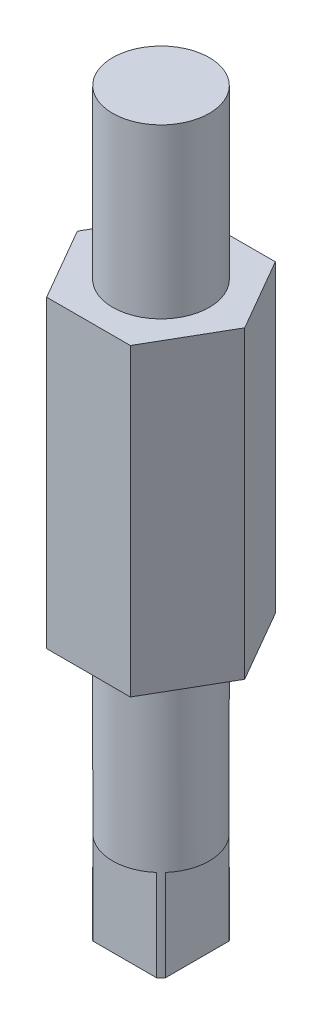
ISO-10303-21;
HEADER;
FILE_DESCRIPTION(('STEP AP214'),'2;1');
FILE_NAME('part.step','',(''),(''),'','','');
FILE_SCHEMA(('AUTOMOTIVE_DESIGN { 1 0 10303 214 1 1 1 1 }'));
ENDSEC;
DATA;
#1=APPLICATION_CONTEXT('core data for automotive mechanical design processes');
#2=APPLICATION_PROTOCOL_DEFINITION('international standard','automotive_design',2000,#1);
#3=PRODUCT_CONTEXT('',#1,'mechanical');
#4=PRODUCT('Part','Part','',(#3));
#5=PRODUCT_RELATED_PRODUCT_CATEGORY('part','',(#4));
#6=PRODUCT_DEFINITION_FORMATION('','',#4);
#7=PRODUCT_DEFINITION_CONTEXT('part definition',#1,'design');
#8=PRODUCT_DEFINITION('design','',#6,#7);
#9=PRODUCT_DEFINITION_SHAPE('','',#8);
#10=(LENGTH_UNIT() NAMED_UNIT(*) SI_UNIT(.MILLI.,.METRE.));
#11=(NAMED_UNIT(*) PLANE_ANGLE_UNIT() SI_UNIT($,.RADIAN.));
#12=(NAMED_UNIT(*) SI_UNIT($,.STERADIAN.) SOLID_ANGLE_UNIT());
#13=UNCERTAINTY_MEASURE_WITH_UNIT(LENGTH_MEASURE(1.E-05),#10,'distance_accuracy_value','');
#14=(GEOMETRIC_REPRESENTATION_CONTEXT(3) GLOBAL_UNCERTAINTY_ASSIGNED_CONTEXT((#13)) GLOBAL_UNIT_ASSIGNED_CONTEXT((#10,
#11,#12)) REPRESENTATION_CONTEXT('',''));
#15=CARTESIAN_POINT('',(0.,0.,0.));
#16=DIRECTION('',(0.,0.,1.));
#17=DIRECTION('',(1.,0.,0.));
#18=AXIS2_PLACEMENT_3D('',#15,#16,#17);
#19=CARTESIAN_POINT('',(0.,35.,0.));
#20=DIRECTION('',(0.,-1.,0.));
#21=DIRECTION('',(0.,0.,-1.));
#22=AXIS2_PLACEMENT_3D('',#19,#20,#21);
#23=CYLINDRICAL_SURFACE('',#22,6.35);
#24=CARTESIAN_POINT('',(0.,35.,0.));
#25=DIRECTION('',(0.,-1.,0.));
#26=DIRECTION('',(0.,0.,-1.));
#27=AXIS2_PLACEMENT_3D('',#24,#25,#26);
#28=CIRCLE('',#27,6.35);
#29=CARTESIAN_POINT('',(0.,35.,-6.35));
#30=VERTEX_POINT('',#29);
#31=EDGE_CURVE('E159',#30,#30,#28,.T.);
#32=ORIENTED_EDGE('',*,*,#31,.T.);
#33=EDGE_LOOP('',(#32));
#34=FACE_BOUND('',#33,.T.);
#35=CARTESIAN_POINT('',(0.,0.,0.));
#36=DIRECTION('',(0.,-1.,0.));
#37=DIRECTION('',(0.,0.,-1.));
#38=AXIS2_PLACEMENT_3D('',#35,#36,#37);
#39=CIRCLE('',#38,6.35);
#40=CARTESIAN_POINT('',(4.7625,0.,4.20013020631504));
#41=VERTEX_POINT('',#40);
#42=CARTESIAN_POINT('',(4.20013020631503,0.,4.7625));
#43=VERTEX_POINT('',#42);
#44=EDGE_CURVE('E149',#41,#43,#39,.T.);
#45=ORIENTED_EDGE('',*,*,#44,.F.);
#46=DIRECTION('',(0.,-1.,0.));
#47=VECTOR('',#46,1.);
#48=CARTESIAN_POINT('',(4.7625,35.,4.20013020631504));
#49=LINE('',#48,#47);
#50=CARTESIAN_POINT('',(4.7625,12.,4.20013020631503));
#51=VERTEX_POINT('',#50);
#52=EDGE_CURVE('E246',#41,#51,#49,.F.);
#53=ORIENTED_EDGE('',*,*,#52,.T.);
#54=CARTESIAN_POINT('',(0.,12.,0.));
#55=DIRECTION('',(0.,-1.,0.));
#56=DIRECTION('',(0.,0.,-1.));
#57=AXIS2_PLACEMENT_3D('',#54,#55,#56);
#58=CIRCLE('',#57,6.35);
#59=CARTESIAN_POINT('',(4.7625,12.,-4.20013020631504));
#60=VERTEX_POINT('',#59);
#61=EDGE_CURVE('E11',#51,#60,#58,.F.);
#62=ORIENTED_EDGE('',*,*,#61,.T.);
#63=DIRECTION('',(0.,-1.,0.));
#64=VECTOR('',#63,1.);
#65=CARTESIAN_POINT('',(4.7625,35.,-4.20013020631504));
#66=LINE('',#65,#64);
#67=CARTESIAN_POINT('',(4.7625,0.,-4.20013020631504));
#68=VERTEX_POINT('',#67);
#69=EDGE_CURVE('E245',#60,#68,#66,.T.);
#70=ORIENTED_EDGE('',*,*,#69,.T.);
#71=CARTESIAN_POINT('',(4.20013020631504,0.,-4.7625));
#72=VERTEX_POINT('',#71);
#73=EDGE_CURVE('E156',#72,#68,#39,.T.);
#74=ORIENTED_EDGE('',*,*,#73,.F.);
#75=DIRECTION('',(0.,-1.,0.));
#76=VECTOR('',#75,1.);
#77=CARTESIAN_POINT('',(4.20013020631504,35.,-4.7625));
#78=LINE('',#77,#76);
#79=CARTESIAN_POINT('',(4.20013020631503,12.,-4.7625));
#80=VERTEX_POINT('',#79);
#81=EDGE_CURVE('E225',#72,#80,#78,.F.);
#82=ORIENTED_EDGE('',*,*,#81,.T.);
#83=CARTESIAN_POINT('',(-4.20013020631504,12.,-4.7625));
#84=VERTEX_POINT('',#83);
#85=EDGE_CURVE('E41',#80,#84,#58,.F.);
#86=ORIENTED_EDGE('',*,*,#85,.T.);
#87=DIRECTION('',(0.,-1.,0.));
#88=VECTOR('',#87,1.);
#89=CARTESIAN_POINT('',(-4.20013020631504,35.,-4.7625));
#90=LINE('',#89,#88);
#91=CARTESIAN_POINT('',(-4.20013020631504,0.,-4.7625));
#92=VERTEX_POINT('',#91);
#93=EDGE_CURVE('E222',#84,#92,#90,.T.);
#94=ORIENTED_EDGE('',*,*,#93,.T.);
#95=CARTESIAN_POINT('',(-4.7625,0.,-4.20013020631504));
#96=VERTEX_POINT('',#95);
#97=EDGE_CURVE('E160',#96,#92,#39,.T.);
#98=ORIENTED_EDGE('',*,*,#97,.F.);
#99=DIRECTION('',(0.,-1.,0.));
#100=VECTOR('',#99,1.);
#101=CARTESIAN_POINT('',(-4.7625,35.,-4.20013020631504));
#102=LINE('',#101,#100);
#103=CARTESIAN_POINT('',(-4.7625,12.,-4.20013020631504));
#104=VERTEX_POINT('',#103);
#105=EDGE_CURVE('E48',#96,#104,#102,.F.);
#106=ORIENTED_EDGE('',*,*,#105,.T.);
#107=CARTESIAN_POINT('',(-4.7625,12.,4.20013020631503));
#108=VERTEX_POINT('',#107);
#109=EDGE_CURVE('E215',#104,#108,#58,.F.);
#110=ORIENTED_EDGE('',*,*,#109,.T.);
#111=DIRECTION('',(0.,-1.,0.));
#112=VECTOR('',#111,1.);
#113=CARTESIAN_POINT('',(-4.7625,35.,4.20013020631504));
#114=LINE('',#113,#112);
#115=CARTESIAN_POINT('',(-4.7625,0.,4.20013020631503));
#116=VERTEX_POINT('',#115);
#117=EDGE_CURVE('E240',#108,#116,#114,.T.);
#118=ORIENTED_EDGE('',*,*,#117,.T.);
#119=CARTESIAN_POINT('',(-4.20013020631504,0.,4.7625));
#120=VERTEX_POINT('',#119);
#121=EDGE_CURVE('E157',#120,#116,#39,.T.);
#122=ORIENTED_EDGE('',*,*,#121,.F.);
#123=DIRECTION('',(0.,-1.,0.));
#124=VECTOR('',#123,1.);
#125=CARTESIAN_POINT('',(-4.20013020631504,35.,4.7625));
#126=LINE('',#125,#124);
#127=CARTESIAN_POINT('',(-4.20013020631504,12.,4.7625));
#128=VERTEX_POINT('',#127);
#129=EDGE_CURVE('E56',#120,#128,#126,.F.);
#130=ORIENTED_EDGE('',*,*,#129,.T.);
#131=CARTESIAN_POINT('',(4.20013020631503,12.,4.7625));
#132=VERTEX_POINT('',#131);
#133=EDGE_CURVE('E36',#128,#132,#58,.F.);
#134=ORIENTED_EDGE('',*,*,#133,.T.);
#135=DIRECTION('',(0.,-1.,0.));
#136=VECTOR('',#135,1.);
#137=CARTESIAN_POINT('',(4.20013020631504,35.,4.7625));
#138=LINE('',#137,#136);
#139=EDGE_CURVE('E136',#132,#43,#138,.T.);
#140=ORIENTED_EDGE('',*,*,#139,.T.);
#141=EDGE_LOOP('',(#45,#53,#62,#70,#74,#82,#86,#94,#98,#106,#110,#118,#122,#130,#134,#140));
#142=FACE_BOUND('',#141,.T.);
#143=ADVANCED_FACE('F32',(#34,#142),#23,.T.);
#144=CARTESIAN_POINT('',(0.,0.,0.));
#145=DIRECTION('',(0.,1.,0.));
#146=DIRECTION('',(0.,0.,1.));
#147=AXIS2_PLACEMENT_3D('',#144,#145,#146);
#148=PLANE('',#147);
#149=DIRECTION('',(0.,0.,-1.));
#150=VECTOR('',#149,1.);
#151=CARTESIAN_POINT('',(4.7625,0.,0.));
#152=LINE('',#151,#150);
#153=EDGE_CURVE('E155',#41,#68,#152,.T.);
#154=ORIENTED_EDGE('',*,*,#153,.F.);
#155=ORIENTED_EDGE('',*,*,#44,.T.);
#156=DIRECTION('',(1.,0.,0.));
#157=VECTOR('',#156,1.);
#158=CARTESIAN_POINT('',(0.,0.,4.7625));
#159=LINE('',#158,#157);
#160=EDGE_CURVE('E133',#120,#43,#159,.T.);
#161=ORIENTED_EDGE('',*,*,#160,.F.);
#162=ORIENTED_EDGE('',*,*,#121,.T.);
#163=DIRECTION('',(0.,0.,1.));
#164=VECTOR('',#163,1.);
#165=CARTESIAN_POINT('',(-4.7625,0.,0.));
#166=LINE('',#165,#164);
#167=EDGE_CURVE('E142',#96,#116,#166,.T.);
#168=ORIENTED_EDGE('',*,*,#167,.F.);
#169=ORIENTED_EDGE('',*,*,#97,.T.);
#170=DIRECTION('',(-1.,0.,0.));
#171=VECTOR('',#170,1.);
#172=CARTESIAN_POINT('',(0.,0.,-4.7625));
#173=LINE('',#172,#171);
#174=EDGE_CURVE('E212',#72,#92,#173,.T.);
#175=ORIENTED_EDGE('',*,*,#174,.F.);
#176=ORIENTED_EDGE('',*,*,#73,.T.);
#177=EDGE_LOOP('',(#154,#155,#161,#162,#168,#169,#175,#176));
#178=FACE_BOUND('',#177,.T.);
#179=ADVANCED_FACE('F153',(#178),#148,.F.);
#180=CARTESIAN_POINT('',(10.9985226280624,97.0775,0.));
#181=DIRECTION('',(-0.866025403784438,0.,0.5));
#182=DIRECTION('',(0.5,0.,0.866025403784439));
#183=AXIS2_PLACEMENT_3D('',#180,#181,#182);
#184=PLANE('',#183);
#185=DIRECTION('',(0.5,0.,0.866025403784439));
#186=VECTOR('',#185,1.);
#187=CARTESIAN_POINT('',(5.49926131403118,35.,-9.525));
#188=LINE('',#187,#186);
#189=CARTESIAN_POINT('',(5.49926131403118,35.,-9.525));
#190=VERTEX_POINT('',#189);
#191=CARTESIAN_POINT('',(10.9985226280624,35.,0.));
#192=VERTEX_POINT('',#191);
#193=EDGE_CURVE('E166',#190,#192,#188,.T.);
#194=ORIENTED_EDGE('',*,*,#193,.F.);
#195=DIRECTION('',(0.,-1.,0.));
#196=VECTOR('',#195,1.);
#197=CARTESIAN_POINT('',(5.49926131403118,97.0775,-9.525));
#198=LINE('',#197,#196);
#199=CARTESIAN_POINT('',(5.49926131403118,74.9975,-9.525));
#200=VERTEX_POINT('',#199);
#201=EDGE_CURVE('E143',#200,#190,#198,.T.);
#202=ORIENTED_EDGE('',*,*,#201,.F.);
#203=DIRECTION('',(-0.5,0.,-0.866025403784439));
#204=VECTOR('',#203,1.);
#205=CARTESIAN_POINT('',(10.9985226280624,74.9975,0.));
#206=LINE('',#205,#204);
#207=CARTESIAN_POINT('',(10.9985226280624,74.9975,0.));
#208=VERTEX_POINT('',#207);
#209=EDGE_CURVE('E184',#208,#200,#206,.T.);
#210=ORIENTED_EDGE('',*,*,#209,.F.);
#211=DIRECTION('',(0.,-1.,0.));
#212=VECTOR('',#211,1.);
#213=CARTESIAN_POINT('',(10.9985226280624,97.0775,0.));
#214=LINE('',#213,#212);
#215=EDGE_CURVE('E194',#208,#192,#214,.T.);
#216=ORIENTED_EDGE('',*,*,#215,.T.);
#217=EDGE_LOOP('',(#194,#202,#210,#216));
#218=FACE_BOUND('',#217,.T.);
#219=ADVANCED_FACE('F34',(#218),#184,.F.);
#220=CARTESIAN_POINT('',(5.49926131403118,97.0775,-9.525));
#221=DIRECTION('',(0.,0.,1.));
#222=DIRECTION('',(1.,0.,0.));
#223=AXIS2_PLACEMENT_3D('',#220,#221,#222);
#224=PLANE('',#223);
#225=DIRECTION('',(1.,0.,0.));
#226=VECTOR('',#225,1.);
#227=CARTESIAN_POINT('',(-5.49926131403118,35.,-9.525));
#228=LINE('',#227,#226);
#229=CARTESIAN_POINT('',(-5.49926131403118,35.,-9.525));
#230=VERTEX_POINT('',#229);
#231=EDGE_CURVE('E164',#230,#190,#228,.T.);
#232=ORIENTED_EDGE('',*,*,#231,.F.);
#233=DIRECTION('',(0.,-1.,0.));
#234=VECTOR('',#233,1.);
#235=CARTESIAN_POINT('',(-5.49926131403118,97.0775,-9.525));
#236=LINE('',#235,#234);
#237=CARTESIAN_POINT('',(-5.49926131403118,74.9975,-9.525));
#238=VERTEX_POINT('',#237);
#239=EDGE_CURVE('E206',#238,#230,#236,.T.);
#240=ORIENTED_EDGE('',*,*,#239,.F.);
#241=DIRECTION('',(-1.,0.,0.));
#242=VECTOR('',#241,1.);
#243=CARTESIAN_POINT('',(5.49926131403118,74.9975,-9.525));
#244=LINE('',#243,#242);
#245=EDGE_CURVE('E186',#200,#238,#244,.T.);
#246=ORIENTED_EDGE('',*,*,#245,.F.);
#247=ORIENTED_EDGE('',*,*,#201,.T.);
#248=EDGE_LOOP('',(#232,#240,#246,#247));
#249=FACE_BOUND('',#248,.T.);
#250=ADVANCED_FACE('F304',(#249),#224,.F.);
#251=CARTESIAN_POINT('',(-5.49926131403118,97.0775,-9.525));
#252=DIRECTION('',(0.866025403784439,0.,0.5));
#253=DIRECTION('',(0.5,0.,-0.866025403784439));
#254=AXIS2_PLACEMENT_3D('',#251,#252,#253);
#255=PLANE('',#254);
#256=DIRECTION('',(0.5,0.,-0.866025403784439));
#257=VECTOR('',#256,1.);
#258=CARTESIAN_POINT('',(-10.9985226280624,35.,0.));
#259=LINE('',#258,#257);
#260=CARTESIAN_POINT('',(-10.9985226280624,35.,0.));
#261=VERTEX_POINT('',#260);
#262=EDGE_CURVE('E174',#261,#230,#259,.T.);
#263=ORIENTED_EDGE('',*,*,#262,.F.);
#264=DIRECTION('',(0.,-1.,0.));
#265=VECTOR('',#264,1.);
#266=CARTESIAN_POINT('',(-10.9985226280624,97.0775,0.));
#267=LINE('',#266,#265);
#268=CARTESIAN_POINT('',(-10.9985226280624,74.9975,0.));
#269=VERTEX_POINT('',#268);
#270=EDGE_CURVE('E203',#269,#261,#267,.T.);
#271=ORIENTED_EDGE('',*,*,#270,.F.);
#272=DIRECTION('',(-0.5,0.,0.866025403784439));
#273=VECTOR('',#272,1.);
#274=CARTESIAN_POINT('',(-5.49926131403118,74.9975,-9.525));
#275=LINE('',#274,#273);
#276=EDGE_CURVE('E188',#238,#269,#275,.T.);
#277=ORIENTED_EDGE('',*,*,#276,.F.);
#278=ORIENTED_EDGE('',*,*,#239,.T.);
#279=EDGE_LOOP('',(#263,#271,#277,#278));
#280=FACE_BOUND('',#279,.T.);
#281=ADVANCED_FACE('F301',(#280),#255,.F.);
#282=CARTESIAN_POINT('',(-10.9985226280624,97.0775,0.));
#283=DIRECTION('',(0.866025403784438,0.,-0.5));
#284=DIRECTION('',(-0.5,0.,-0.866025403784438));
#285=AXIS2_PLACEMENT_3D('',#282,#283,#284);
#286=PLANE('',#285);
#287=DIRECTION('',(-0.5,0.,-0.866025403784438));
#288=VECTOR('',#287,1.);
#289=CARTESIAN_POINT('',(-5.49926131403117,35.,9.525));
#290=LINE('',#289,#288);
#291=CARTESIAN_POINT('',(-5.49926131403117,35.,9.525));
#292=VERTEX_POINT('',#291);
#293=EDGE_CURVE('E172',#292,#261,#290,.T.);
#294=ORIENTED_EDGE('',*,*,#293,.F.);
#295=DIRECTION('',(0.,-1.,0.));
#296=VECTOR('',#295,1.);
#297=CARTESIAN_POINT('',(-5.49926131403117,97.0775,9.525));
#298=LINE('',#297,#296);
#299=CARTESIAN_POINT('',(-5.49926131403117,74.9975,9.525));
#300=VERTEX_POINT('',#299);
#301=EDGE_CURVE('E200',#300,#292,#298,.T.);
#302=ORIENTED_EDGE('',*,*,#301,.F.);
#303=DIRECTION('',(0.5,0.,0.866025403784438));
#304=VECTOR('',#303,1.);
#305=CARTESIAN_POINT('',(-10.9985226280624,74.9975,0.));
#306=LINE('',#305,#304);
#307=EDGE_CURVE('E190',#269,#300,#306,.T.);
#308=ORIENTED_EDGE('',*,*,#307,.F.);
#309=ORIENTED_EDGE('',*,*,#270,.T.);
#310=EDGE_LOOP('',(#294,#302,#308,#309));
#311=FACE_BOUND('',#310,.T.);
#312=ADVANCED_FACE('F297',(#311),#286,.F.);
#313=CARTESIAN_POINT('',(-5.49926131403117,97.0775,9.525));
#314=DIRECTION('',(0.,0.,-1.));
#315=DIRECTION('',(-1.,0.,0.));
#316=AXIS2_PLACEMENT_3D('',#313,#314,#315);
#317=PLANE('',#316);
#318=DIRECTION('',(-1.,0.,0.));
#319=VECTOR('',#318,1.);
#320=CARTESIAN_POINT('',(5.49926131403118,35.,9.525));
#321=LINE('',#320,#319);
#322=CARTESIAN_POINT('',(5.49926131403118,35.,9.525));
#323=VERTEX_POINT('',#322);
#324=EDGE_CURVE('E170',#323,#292,#321,.T.);
#325=ORIENTED_EDGE('',*,*,#324,.F.);
#326=DIRECTION('',(0.,-1.,0.));
#327=VECTOR('',#326,1.);
#328=CARTESIAN_POINT('',(5.49926131403118,97.0775,9.525));
#329=LINE('',#328,#327);
#330=CARTESIAN_POINT('',(5.49926131403118,74.9975,9.525));
#331=VERTEX_POINT('',#330);
#332=EDGE_CURVE('E197',#331,#323,#329,.T.);
#333=ORIENTED_EDGE('',*,*,#332,.F.);
#334=DIRECTION('',(1.,0.,0.));
#335=VECTOR('',#334,1.);
#336=CARTESIAN_POINT('',(-5.49926131403117,74.9975,9.525));
#337=LINE('',#336,#335);
#338=EDGE_CURVE('E192',#300,#331,#337,.T.);
#339=ORIENTED_EDGE('',*,*,#338,.F.);
#340=ORIENTED_EDGE('',*,*,#301,.T.);
#341=EDGE_LOOP('',(#325,#333,#339,#340));
#342=FACE_BOUND('',#341,.T.);
#343=ADVANCED_FACE('F293',(#342),#317,.F.);
#344=CARTESIAN_POINT('',(5.49926131403118,97.0775,9.525));
#345=DIRECTION('',(-0.866025403784439,0.,-0.5));
#346=DIRECTION('',(-0.5,0.,0.866025403784439));
#347=AXIS2_PLACEMENT_3D('',#344,#345,#346);
#348=PLANE('',#347);
#349=DIRECTION('',(-0.5,0.,0.866025403784439));
#350=VECTOR('',#349,1.);
#351=CARTESIAN_POINT('',(10.9985226280624,35.,0.));
#352=LINE('',#351,#350);
#353=EDGE_CURVE('E168',#192,#323,#352,.T.);
#354=ORIENTED_EDGE('',*,*,#353,.F.);
#355=ORIENTED_EDGE('',*,*,#215,.F.);
#356=DIRECTION('',(0.5,0.,-0.866025403784439));
#357=VECTOR('',#356,1.);
#358=CARTESIAN_POINT('',(5.49926131403118,74.9975,9.525));
#359=LINE('',#358,#357);
#360=EDGE_CURVE('E180',#331,#208,#359,.T.);
#361=ORIENTED_EDGE('',*,*,#360,.F.);
#362=ORIENTED_EDGE('',*,*,#332,.T.);
#363=EDGE_LOOP('',(#354,#355,#361,#362));
#364=FACE_BOUND('',#363,.T.);
#365=ADVANCED_FACE('F286',(#364),#348,.F.);
#366=CARTESIAN_POINT('',(0.,74.9975,0.));
#367=DIRECTION('',(0.,1.,0.));
#368=DIRECTION('',(0.,0.,1.));
#369=AXIS2_PLACEMENT_3D('',#366,#367,#368);
#370=PLANE('',#369);
#371=CARTESIAN_POINT('',(0.,74.9975,0.));
#372=DIRECTION('',(0.,1.,0.));
#373=DIRECTION('',(0.,0.,1.));
#374=AXIS2_PLACEMENT_3D('',#371,#372,#373);
#375=CIRCLE('',#374,6.35);
#376=CARTESIAN_POINT('',(0.,74.9975,6.35));
#377=VERTEX_POINT('',#376);
#378=EDGE_CURVE('E177',#377,#377,#375,.T.);
#379=ORIENTED_EDGE('',*,*,#378,.F.);
#380=EDGE_LOOP('',(#379));
#381=FACE_BOUND('',#380,.T.);
#382=ORIENTED_EDGE('',*,*,#360,.T.);
#383=ORIENTED_EDGE('',*,*,#209,.T.);
#384=ORIENTED_EDGE('',*,*,#245,.T.);
#385=ORIENTED_EDGE('',*,*,#276,.T.);
#386=ORIENTED_EDGE('',*,*,#307,.T.);
#387=ORIENTED_EDGE('',*,*,#338,.T.);
#388=EDGE_LOOP('',(#382,#383,#384,#385,#386,#387));
#389=FACE_BOUND('',#388,.T.);
#390=ADVANCED_FACE('F282',(#381,#389),#370,.T.);
#391=CARTESIAN_POINT('',(0.,74.9975,0.));
#392=DIRECTION('',(0.,1.,0.));
#393=DIRECTION('',(0.,0.,1.));
#394=AXIS2_PLACEMENT_3D('',#391,#392,#393);
#395=CYLINDRICAL_SURFACE('',#394,6.35);
#396=ORIENTED_EDGE('',*,*,#378,.T.);
#397=EDGE_LOOP('',(#396));
#398=FACE_BOUND('',#397,.T.);
#399=CARTESIAN_POINT('',(0.,97.0775,0.));
#400=DIRECTION('',(0.,1.,0.));
#401=DIRECTION('',(0.,0.,1.));
#402=AXIS2_PLACEMENT_3D('',#399,#400,#401);
#403=CIRCLE('',#402,6.35);
#404=CARTESIAN_POINT('',(0.,97.0775,6.35));
#405=VERTEX_POINT('',#404);
#406=EDGE_CURVE('E176',#405,#405,#403,.T.);
#407=ORIENTED_EDGE('',*,*,#406,.F.);
#408=EDGE_LOOP('',(#407));
#409=FACE_BOUND('',#408,.T.);
#410=ADVANCED_FACE('F279',(#398,#409),#395,.T.);
#411=CARTESIAN_POINT('',(0.,97.0775,0.));
#412=DIRECTION('',(0.,1.,0.));
#413=DIRECTION('',(0.,0.,1.));
#414=AXIS2_PLACEMENT_3D('',#411,#412,#413);
#415=PLANE('',#414);
#416=ORIENTED_EDGE('',*,*,#406,.T.);
#417=EDGE_LOOP('',(#416));
#418=FACE_BOUND('',#417,.T.);
#419=ADVANCED_FACE('F277',(#418),#415,.T.);
#420=CARTESIAN_POINT('',(0.,35.,0.));
#421=DIRECTION('',(0.,-1.,0.));
#422=DIRECTION('',(0.,0.,-1.));
#423=AXIS2_PLACEMENT_3D('',#420,#421,#422);
#424=PLANE('',#423);
#425=ORIENTED_EDGE('',*,*,#31,.F.);
#426=EDGE_LOOP('',(#425));
#427=FACE_BOUND('',#426,.T.);
#428=ORIENTED_EDGE('',*,*,#231,.T.);
#429=ORIENTED_EDGE('',*,*,#193,.T.);
#430=ORIENTED_EDGE('',*,*,#353,.T.);
#431=ORIENTED_EDGE('',*,*,#324,.T.);
#432=ORIENTED_EDGE('',*,*,#293,.T.);
#433=ORIENTED_EDGE('',*,*,#262,.T.);
#434=EDGE_LOOP('',(#428,#429,#430,#431,#432,#433));
#435=FACE_BOUND('',#434,.T.);
#436=ADVANCED_FACE('F274',(#427,#435),#424,.T.);
#437=CARTESIAN_POINT('',(-4.7625,12.,4.7625));
#438=DIRECTION('',(0.,0.,1.));
#439=DIRECTION('',(1.,0.,0.));
#440=AXIS2_PLACEMENT_3D('',#437,#438,#439);
#441=PLANE('',#440);
#442=ORIENTED_EDGE('',*,*,#160,.T.);
#443=ORIENTED_EDGE('',*,*,#139,.F.);
#444=DIRECTION('',(-1.,0.,0.));
#445=VECTOR('',#444,1.);
#446=CARTESIAN_POINT('',(-4.7625,12.,4.7625));
#447=LINE('',#446,#445);
#448=EDGE_CURVE('E235',#132,#128,#447,.T.);
#449=ORIENTED_EDGE('',*,*,#448,.T.);
#450=ORIENTED_EDGE('',*,*,#129,.F.);
#451=EDGE_LOOP('',(#442,#443,#449,#450));
#452=FACE_BOUND('',#451,.T.);
#453=ADVANCED_FACE('F135',(#452),#441,.T.);
#454=CARTESIAN_POINT('',(0.,12.,0.));
#455=DIRECTION('',(0.,-1.,0.));
#456=DIRECTION('',(0.,0.,-1.));
#457=AXIS2_PLACEMENT_3D('',#454,#455,#456);
#458=PLANE('',#457);
#459=ORIENTED_EDGE('',*,*,#448,.F.);
#460=ORIENTED_EDGE('',*,*,#133,.F.);
#461=EDGE_LOOP('',(#459,#460));
#462=FACE_BOUND('',#461,.T.);
#463=ADVANCED_FACE('F253',(#462),#458,.T.);
#464=CARTESIAN_POINT('',(-4.7625,12.,-4.7625));
#465=DIRECTION('',(-1.,0.,0.));
#466=DIRECTION('',(0.,0.,1.));
#467=AXIS2_PLACEMENT_3D('',#464,#465,#466);
#468=PLANE('',#467);
#469=ORIENTED_EDGE('',*,*,#167,.T.);
#470=ORIENTED_EDGE('',*,*,#117,.F.);
#471=DIRECTION('',(0.,0.,-1.));
#472=VECTOR('',#471,1.);
#473=CARTESIAN_POINT('',(-4.7625,12.,-4.7625));
#474=LINE('',#473,#472);
#475=EDGE_CURVE('E233',#108,#104,#474,.T.);
#476=ORIENTED_EDGE('',*,*,#475,.T.);
#477=ORIENTED_EDGE('',*,*,#105,.F.);
#478=EDGE_LOOP('',(#469,#470,#476,#477));
#479=FACE_BOUND('',#478,.T.);
#480=ADVANCED_FACE('F247',(#479),#468,.T.);
#481=ORIENTED_EDGE('',*,*,#475,.F.);
#482=ORIENTED_EDGE('',*,*,#109,.F.);
#483=EDGE_LOOP('',(#481,#482));
#484=FACE_BOUND('',#483,.T.);
#485=ADVANCED_FACE('F250',(#484),#458,.T.);
#486=CARTESIAN_POINT('',(-4.7625,12.,-4.7625));
#487=DIRECTION('',(0.,0.,-1.));
#488=DIRECTION('',(-1.,0.,0.));
#489=AXIS2_PLACEMENT_3D('',#486,#487,#488);
#490=PLANE('',#489);
#491=ORIENTED_EDGE('',*,*,#174,.T.);
#492=ORIENTED_EDGE('',*,*,#93,.F.);
#493=DIRECTION('',(1.,0.,0.));
#494=VECTOR('',#493,1.);
#495=CARTESIAN_POINT('',(-4.7625,12.,-4.7625));
#496=LINE('',#495,#494);
#497=EDGE_CURVE('E150',#84,#80,#496,.T.);
#498=ORIENTED_EDGE('',*,*,#497,.T.);
#499=ORIENTED_EDGE('',*,*,#81,.F.);
#500=EDGE_LOOP('',(#491,#492,#498,#499));
#501=FACE_BOUND('',#500,.T.);
#502=ADVANCED_FACE('F231',(#501),#490,.T.);
#503=ORIENTED_EDGE('',*,*,#497,.F.);
#504=ORIENTED_EDGE('',*,*,#85,.F.);
#505=EDGE_LOOP('',(#503,#504));
#506=FACE_BOUND('',#505,.T.);
#507=ADVANCED_FACE('F229',(#506),#458,.T.);
#508=DIRECTION('',(0.,0.,1.));
#509=VECTOR('',#508,1.);
#510=CARTESIAN_POINT('',(4.7625,12.,-4.7625));
#511=LINE('',#510,#509);
#512=EDGE_CURVE('E401',#60,#51,#511,.T.);
#513=ORIENTED_EDGE('',*,*,#512,.F.);
#514=ORIENTED_EDGE('',*,*,#61,.F.);
#515=EDGE_LOOP('',(#513,#514));
#516=FACE_BOUND('',#515,.T.);
#517=ADVANCED_FACE('F264',(#516),#458,.T.);
#518=CARTESIAN_POINT('',(4.7625,12.,-4.7625));
#519=DIRECTION('',(1.,0.,0.));
#520=DIRECTION('',(0.,0.,-1.));
#521=AXIS2_PLACEMENT_3D('',#518,#519,#520);
#522=PLANE('',#521);
#523=ORIENTED_EDGE('',*,*,#153,.T.);
#524=ORIENTED_EDGE('',*,*,#69,.F.);
#525=ORIENTED_EDGE('',*,*,#512,.T.);
#526=ORIENTED_EDGE('',*,*,#52,.F.);
#527=EDGE_LOOP('',(#523,#524,#525,#526));
#528=FACE_BOUND('',#527,.T.);
#529=ADVANCED_FACE('F388',(#528),#522,.T.);
#530=CLOSED_SHELL('',(#143,#179,#219,#250,#281,#312,#343,#365,#390,#410,#419,#436,#453,#463,
#480,#485,#502,#507,#517,#529));
#531=MANIFOLD_SOLID_BREP('B2',#530);
#532=ADVANCED_BREP_SHAPE_REPRESENTATION('',(#18,#531),#14);
#533=SHAPE_DEFINITION_REPRESENTATION(#9,#532);
ENDSEC;
END-ISO-10303-21;
